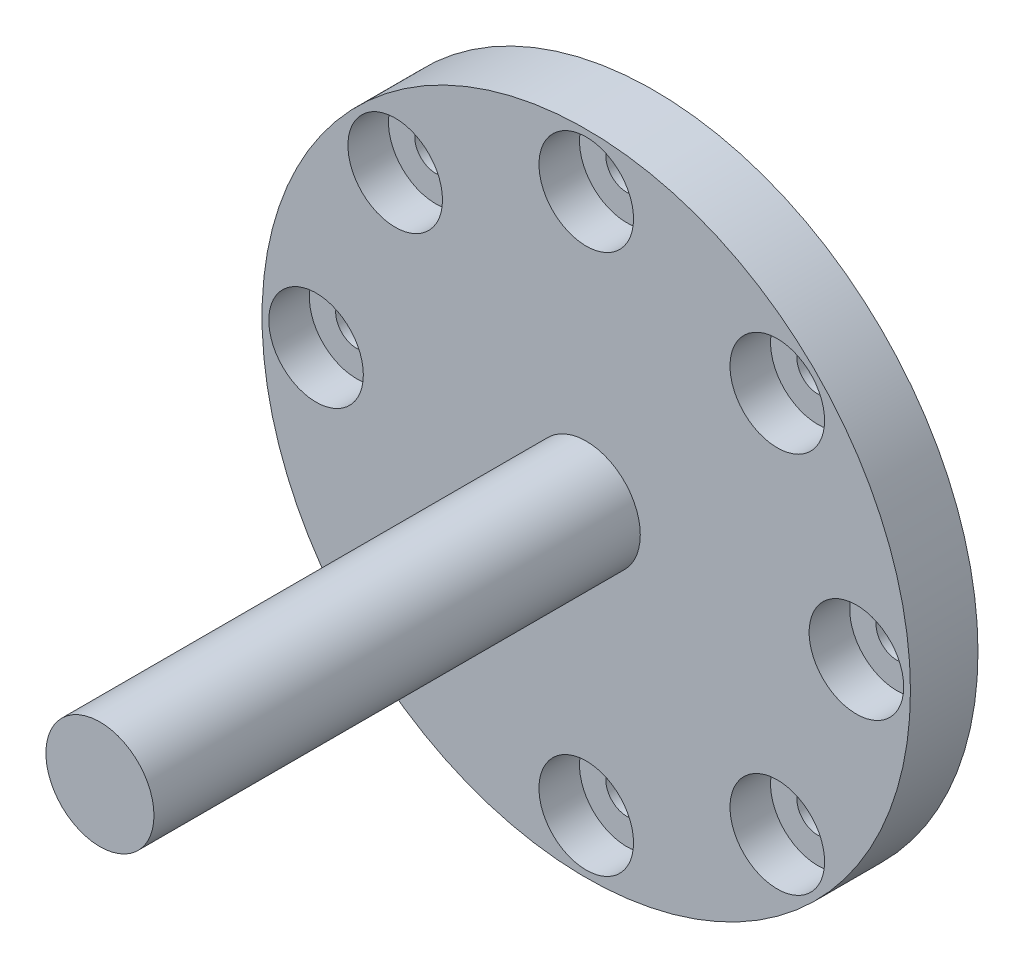
ISO-10303-21;
HEADER;
FILE_DESCRIPTION(('STEP AP214'),'2;1');
FILE_NAME('part.step','',(''),(''),'','','');
FILE_SCHEMA(('AUTOMOTIVE_DESIGN { 1 0 10303 214 1 1 1 1 }'));
ENDSEC;
DATA;
#1=APPLICATION_CONTEXT('core data for automotive mechanical design processes');
#2=APPLICATION_PROTOCOL_DEFINITION('international standard','automotive_design',2000,#1);
#3=PRODUCT_CONTEXT('',#1,'mechanical');
#4=PRODUCT('Part','Part','',(#3));
#5=PRODUCT_RELATED_PRODUCT_CATEGORY('part','',(#4));
#6=PRODUCT_DEFINITION_FORMATION('','',#4);
#7=PRODUCT_DEFINITION_CONTEXT('part definition',#1,'design');
#8=PRODUCT_DEFINITION('design','',#6,#7);
#9=PRODUCT_DEFINITION_SHAPE('','',#8);
#10=(LENGTH_UNIT() NAMED_UNIT(*) SI_UNIT(.MILLI.,.METRE.));
#11=(NAMED_UNIT(*) PLANE_ANGLE_UNIT() SI_UNIT($,.RADIAN.));
#12=(NAMED_UNIT(*) SI_UNIT($,.STERADIAN.) SOLID_ANGLE_UNIT());
#13=UNCERTAINTY_MEASURE_WITH_UNIT(LENGTH_MEASURE(1.E-05),#10,'distance_accuracy_value','');
#14=(GEOMETRIC_REPRESENTATION_CONTEXT(3) GLOBAL_UNCERTAINTY_ASSIGNED_CONTEXT((#13)) GLOBAL_UNIT_ASSIGNED_CONTEXT((#10,
#11,#12)) REPRESENTATION_CONTEXT('',''));
#15=CARTESIAN_POINT('',(0.,0.,0.));
#16=DIRECTION('',(0.,0.,1.));
#17=DIRECTION('',(1.,0.,0.));
#18=AXIS2_PLACEMENT_3D('',#15,#16,#17);
#19=CARTESIAN_POINT('',(14.1421356237307,14.1421356237303,9.38406204336157));
#20=DIRECTION('',(0.,0.,-1.));
#21=DIRECTION('',(-1.,0.,0.));
#22=AXIS2_PLACEMENT_3D('',#19,#20,#21);
#23=CYLINDRICAL_SURFACE('',#22,1.55000000000065);
#24=CARTESIAN_POINT('',(14.1421356237307,14.1421356237303,0.));
#25=DIRECTION('',(0.,0.,-1.));
#26=DIRECTION('',(-1.,0.,0.));
#27=AXIS2_PLACEMENT_3D('',#24,#25,#26);
#28=CIRCLE('',#27,1.55000000000065);
#29=CARTESIAN_POINT('',(12.5921356237301,14.1421356237303,0.));
#30=VERTEX_POINT('',#29);
#31=EDGE_CURVE('E50',#30,#30,#28,.T.);
#32=ORIENTED_EDGE('',*,*,#31,.T.);
#33=EDGE_LOOP('',(#32));
#34=FACE_BOUND('',#33,.T.);
#35=CARTESIAN_POINT('',(14.1421356237307,14.1421356237303,2.));
#36=DIRECTION('',(0.,0.,1.));
#37=DIRECTION('',(1.,0.,0.));
#38=AXIS2_PLACEMENT_3D('',#35,#36,#37);
#39=CIRCLE('',#38,1.55000000000065);
#40=CARTESIAN_POINT('',(15.6921356237314,14.1421356237303,2.));
#41=VERTEX_POINT('',#40);
#42=EDGE_CURVE('E38',#41,#41,#39,.F.);
#43=ORIENTED_EDGE('',*,*,#42,.F.);
#44=EDGE_LOOP('',(#43));
#45=FACE_BOUND('',#44,.T.);
#46=ADVANCED_FACE('F34',(#34,#45),#23,.F.);
#47=CARTESIAN_POINT('',(19.9999999999992,-8.5265128291212E-13,9.38406204336157));
#48=DIRECTION('',(0.,0.,-1.));
#49=DIRECTION('',(-1.,0.,0.));
#50=AXIS2_PLACEMENT_3D('',#47,#48,#49);
#51=CYLINDRICAL_SURFACE('',#50,1.55000000000126);
#52=CARTESIAN_POINT('',(19.9999999999992,-8.5265128291212E-13,0.));
#53=DIRECTION('',(0.,0.,-1.));
#54=DIRECTION('',(-1.,0.,0.));
#55=AXIS2_PLACEMENT_3D('',#52,#53,#54);
#56=CIRCLE('',#55,1.55000000000126);
#57=CARTESIAN_POINT('',(18.4499999999979,-8.5265128291212E-13,0.));
#58=VERTEX_POINT('',#57);
#59=EDGE_CURVE('E104',#58,#58,#56,.T.);
#60=ORIENTED_EDGE('',*,*,#59,.T.);
#61=EDGE_LOOP('',(#60));
#62=FACE_BOUND('',#61,.T.);
#63=CARTESIAN_POINT('',(19.9999999999992,-8.5265128291212E-13,2.));
#64=DIRECTION('',(0.,0.,1.));
#65=DIRECTION('',(1.,0.,0.));
#66=AXIS2_PLACEMENT_3D('',#63,#64,#65);
#67=CIRCLE('',#66,1.55000000000126);
#68=CARTESIAN_POINT('',(21.5500000000004,-8.5265128291212E-13,2.));
#69=VERTEX_POINT('',#68);
#70=EDGE_CURVE('E71',#69,#69,#67,.F.);
#71=ORIENTED_EDGE('',*,*,#70,.F.);
#72=EDGE_LOOP('',(#71));
#73=FACE_BOUND('',#72,.T.);
#74=ADVANCED_FACE('F134',(#62,#73),#51,.F.);
#75=CARTESIAN_POINT('',(14.1421356237295,-14.1421356237316,9.38406204336157));
#76=DIRECTION('',(0.,0.,-1.));
#77=DIRECTION('',(-1.,0.,0.));
#78=AXIS2_PLACEMENT_3D('',#75,#76,#77);
#79=CYLINDRICAL_SURFACE('',#78,1.55000000000173);
#80=CARTESIAN_POINT('',(14.1421356237295,-14.1421356237316,0.));
#81=DIRECTION('',(0.,0.,-1.));
#82=DIRECTION('',(-1.,0.,0.));
#83=AXIS2_PLACEMENT_3D('',#80,#81,#82);
#84=CIRCLE('',#83,1.55000000000173);
#85=CARTESIAN_POINT('',(12.5921356237278,-14.1421356237316,0.));
#86=VERTEX_POINT('',#85);
#87=EDGE_CURVE('E102',#86,#86,#84,.T.);
#88=ORIENTED_EDGE('',*,*,#87,.T.);
#89=EDGE_LOOP('',(#88));
#90=FACE_BOUND('',#89,.T.);
#91=CARTESIAN_POINT('',(14.1421356237295,-14.1421356237316,2.));
#92=DIRECTION('',(0.,0.,1.));
#93=DIRECTION('',(1.,0.,0.));
#94=AXIS2_PLACEMENT_3D('',#91,#92,#93);
#95=CIRCLE('',#94,1.55000000000173);
#96=CARTESIAN_POINT('',(15.6921356237312,-14.1421356237316,2.));
#97=VERTEX_POINT('',#96);
#98=EDGE_CURVE('E69',#97,#97,#95,.F.);
#99=ORIENTED_EDGE('',*,*,#98,.F.);
#100=EDGE_LOOP('',(#99));
#101=FACE_BOUND('',#100,.T.);
#102=ADVANCED_FACE('F139',(#90,#101),#79,.F.);
#103=CARTESIAN_POINT('',(-1.70040397862765E-12,-20.,9.38406204336157));
#104=DIRECTION('',(0.,0.,-1.));
#105=DIRECTION('',(-1.,0.,0.));
#106=AXIS2_PLACEMENT_3D('',#103,#104,#105);
#107=CYLINDRICAL_SURFACE('',#106,1.55000000000176);
#108=CARTESIAN_POINT('',(-1.70040397862765E-12,-20.,0.));
#109=DIRECTION('',(0.,0.,-1.));
#110=DIRECTION('',(-1.,0.,0.));
#111=AXIS2_PLACEMENT_3D('',#108,#109,#110);
#112=CIRCLE('',#111,1.55000000000176);
#113=CARTESIAN_POINT('',(-1.55000000000346,-20.,0.));
#114=VERTEX_POINT('',#113);
#115=EDGE_CURVE('E99',#114,#114,#112,.T.);
#116=ORIENTED_EDGE('',*,*,#115,.T.);
#117=EDGE_LOOP('',(#116));
#118=FACE_BOUND('',#117,.T.);
#119=CARTESIAN_POINT('',(-1.70040397862765E-12,-20.,2.));
#120=DIRECTION('',(0.,0.,1.));
#121=DIRECTION('',(1.,0.,0.));
#122=AXIS2_PLACEMENT_3D('',#119,#120,#121);
#123=CIRCLE('',#122,1.55000000000176);
#124=CARTESIAN_POINT('',(1.55000000000006,-20.,2.));
#125=VERTEX_POINT('',#124);
#126=EDGE_CURVE('E66',#125,#125,#123,.F.);
#127=ORIENTED_EDGE('',*,*,#126,.F.);
#128=EDGE_LOOP('',(#127));
#129=FACE_BOUND('',#128,.T.);
#130=ADVANCED_FACE('F144',(#118,#129),#107,.F.);
#131=CARTESIAN_POINT('',(-14.1421356237324,-14.1421356237303,9.38406204336157));
#132=DIRECTION('',(0.,0.,-1.));
#133=DIRECTION('',(-1.,0.,0.));
#134=AXIS2_PLACEMENT_3D('',#131,#132,#133);
#135=CYLINDRICAL_SURFACE('',#134,1.55000000000131);
#136=CARTESIAN_POINT('',(-14.1421356237324,-14.1421356237303,0.));
#137=DIRECTION('',(0.,0.,-1.));
#138=DIRECTION('',(-1.,0.,0.));
#139=AXIS2_PLACEMENT_3D('',#136,#137,#138);
#140=CIRCLE('',#139,1.55000000000131);
#141=CARTESIAN_POINT('',(-15.6921356237337,-14.1421356237303,0.));
#142=VERTEX_POINT('',#141);
#143=EDGE_CURVE('E96',#142,#142,#140,.T.);
#144=ORIENTED_EDGE('',*,*,#143,.T.);
#145=EDGE_LOOP('',(#144));
#146=FACE_BOUND('',#145,.T.);
#147=CARTESIAN_POINT('',(-14.1421356237324,-14.1421356237303,2.));
#148=DIRECTION('',(0.,0.,1.));
#149=DIRECTION('',(1.,0.,0.));
#150=AXIS2_PLACEMENT_3D('',#147,#148,#149);
#151=CIRCLE('',#150,1.55000000000131);
#152=CARTESIAN_POINT('',(-12.5921356237311,-14.1421356237303,2.));
#153=VERTEX_POINT('',#152);
#154=EDGE_CURVE('E63',#153,#153,#151,.F.);
#155=ORIENTED_EDGE('',*,*,#154,.F.);
#156=EDGE_LOOP('',(#155));
#157=FACE_BOUND('',#156,.T.);
#158=ADVANCED_FACE('F148',(#146,#157),#135,.F.);
#159=CARTESIAN_POINT('',(-20.0000000000008,8.50201989313825E-13,9.38406204336157));
#160=DIRECTION('',(0.,0.,-1.));
#161=DIRECTION('',(-1.,0.,0.));
#162=AXIS2_PLACEMENT_3D('',#159,#160,#161);
#163=CYLINDRICAL_SURFACE('',#162,1.55000000000063);
#164=CARTESIAN_POINT('',(-20.0000000000008,8.50201989313825E-13,0.));
#165=DIRECTION('',(0.,0.,-1.));
#166=DIRECTION('',(-1.,0.,0.));
#167=AXIS2_PLACEMENT_3D('',#164,#165,#166);
#168=CIRCLE('',#167,1.55000000000063);
#169=CARTESIAN_POINT('',(-21.5500000000015,8.50201989313825E-13,0.));
#170=VERTEX_POINT('',#169);
#171=EDGE_CURVE('E93',#170,#170,#168,.T.);
#172=ORIENTED_EDGE('',*,*,#171,.T.);
#173=EDGE_LOOP('',(#172));
#174=FACE_BOUND('',#173,.T.);
#175=CARTESIAN_POINT('',(-20.0000000000008,8.50201989313825E-13,2.));
#176=DIRECTION('',(0.,0.,1.));
#177=DIRECTION('',(1.,0.,0.));
#178=AXIS2_PLACEMENT_3D('',#175,#176,#177);
#179=CIRCLE('',#178,1.55000000000063);
#180=CARTESIAN_POINT('',(-18.4500000000002,8.50201989313825E-13,2.));
#181=VERTEX_POINT('',#180);
#182=EDGE_CURVE('E60',#181,#181,#179,.F.);
#183=ORIENTED_EDGE('',*,*,#182,.F.);
#184=EDGE_LOOP('',(#183));
#185=FACE_BOUND('',#184,.T.);
#186=ADVANCED_FACE('F152',(#174,#185),#163,.F.);
#187=CARTESIAN_POINT('',(-14.1421356237312,14.1421356237316,9.38406204336157));
#188=DIRECTION('',(0.,0.,-1.));
#189=DIRECTION('',(-1.,0.,0.));
#190=AXIS2_PLACEMENT_3D('',#187,#188,#189);
#191=CYLINDRICAL_SURFACE('',#190,1.5500000000001);
#192=CARTESIAN_POINT('',(-14.1421356237312,14.1421356237316,0.));
#193=DIRECTION('',(0.,0.,-1.));
#194=DIRECTION('',(-1.,0.,0.));
#195=AXIS2_PLACEMENT_3D('',#192,#193,#194);
#196=CIRCLE('',#195,1.5500000000001);
#197=CARTESIAN_POINT('',(-15.6921356237313,14.1421356237316,0.));
#198=VERTEX_POINT('',#197);
#199=EDGE_CURVE('E90',#198,#198,#196,.T.);
#200=ORIENTED_EDGE('',*,*,#199,.T.);
#201=EDGE_LOOP('',(#200));
#202=FACE_BOUND('',#201,.T.);
#203=CARTESIAN_POINT('',(-14.1421356237312,14.1421356237316,2.));
#204=DIRECTION('',(0.,0.,1.));
#205=DIRECTION('',(1.,0.,0.));
#206=AXIS2_PLACEMENT_3D('',#203,#204,#205);
#207=CIRCLE('',#206,1.5500000000001);
#208=CARTESIAN_POINT('',(-12.5921356237311,14.1421356237316,2.));
#209=VERTEX_POINT('',#208);
#210=EDGE_CURVE('E56',#209,#209,#207,.F.);
#211=ORIENTED_EDGE('',*,*,#210,.F.);
#212=EDGE_LOOP('',(#211));
#213=FACE_BOUND('',#212,.T.);
#214=ADVANCED_FACE('F130',(#202,#213),#191,.F.);
#215=CARTESIAN_POINT('',(0.,20.,9.38406204336157));
#216=DIRECTION('',(0.,0.,-1.));
#217=DIRECTION('',(-1.,0.,0.));
#218=AXIS2_PLACEMENT_3D('',#215,#216,#217);
#219=CYLINDRICAL_SURFACE('',#218,1.55);
#220=CARTESIAN_POINT('',(0.,20.,0.));
#221=DIRECTION('',(0.,0.,-1.));
#222=DIRECTION('',(-1.,0.,0.));
#223=AXIS2_PLACEMENT_3D('',#220,#221,#222);
#224=CIRCLE('',#223,1.55);
#225=CARTESIAN_POINT('',(-1.55,20.,0.));
#226=VERTEX_POINT('',#225);
#227=EDGE_CURVE('E47',#226,#226,#224,.T.);
#228=ORIENTED_EDGE('',*,*,#227,.T.);
#229=EDGE_LOOP('',(#228));
#230=FACE_BOUND('',#229,.T.);
#231=CARTESIAN_POINT('',(0.,20.,2.));
#232=DIRECTION('',(0.,0.,1.));
#233=DIRECTION('',(1.,0.,0.));
#234=AXIS2_PLACEMENT_3D('',#231,#232,#233);
#235=CIRCLE('',#234,1.55);
#236=CARTESIAN_POINT('',(1.55,20.,2.));
#237=VERTEX_POINT('',#236);
#238=EDGE_CURVE('E53',#237,#237,#235,.F.);
#239=ORIENTED_EDGE('',*,*,#238,.F.);
#240=EDGE_LOOP('',(#239));
#241=FACE_BOUND('',#240,.T.);
#242=ADVANCED_FACE('F122',(#230,#241),#219,.F.);
#243=CARTESIAN_POINT('',(0.,0.,5.));
#244=DIRECTION('',(0.,0.,-1.));
#245=DIRECTION('',(-1.,0.,0.));
#246=AXIS2_PLACEMENT_3D('',#243,#244,#245);
#247=CYLINDRICAL_SURFACE('',#246,24.);
#248=CARTESIAN_POINT('',(0.,0.,5.));
#249=DIRECTION('',(0.,0.,1.));
#250=DIRECTION('',(1.,0.,0.));
#251=AXIS2_PLACEMENT_3D('',#248,#249,#250);
#252=CIRCLE('',#251,24.);
#253=CARTESIAN_POINT('',(24.,0.,5.));
#254=VERTEX_POINT('',#253);
#255=EDGE_CURVE('E10',#254,#254,#252,.T.);
#256=ORIENTED_EDGE('',*,*,#255,.F.);
#257=EDGE_LOOP('',(#256));
#258=FACE_BOUND('',#257,.T.);
#259=CARTESIAN_POINT('',(0.,0.,0.));
#260=DIRECTION('',(0.,0.,1.));
#261=DIRECTION('',(1.,0.,0.));
#262=AXIS2_PLACEMENT_3D('',#259,#260,#261);
#263=CIRCLE('',#262,24.);
#264=CARTESIAN_POINT('',(24.,0.,0.));
#265=VERTEX_POINT('',#264);
#266=EDGE_CURVE('E42',#265,#265,#263,.T.);
#267=ORIENTED_EDGE('',*,*,#266,.T.);
#268=EDGE_LOOP('',(#267));
#269=FACE_BOUND('',#268,.T.);
#270=ADVANCED_FACE('F36',(#258,#269),#247,.T.);
#271=CARTESIAN_POINT('',(0.,0.,5.));
#272=DIRECTION('',(0.,0.,1.));
#273=DIRECTION('',(1.,0.,0.));
#274=AXIS2_PLACEMENT_3D('',#271,#272,#273);
#275=PLANE('',#274);
#276=CARTESIAN_POINT('',(-14.1421356237307,14.1421356237303,5.));
#277=DIRECTION('',(0.,0.,1.));
#278=DIRECTION('',(1.,0.,0.));
#279=AXIS2_PLACEMENT_3D('',#276,#277,#278);
#280=CIRCLE('',#279,3.50000000000065);
#281=CARTESIAN_POINT('',(-10.6421356237301,14.1421356237303,5.));
#282=VERTEX_POINT('',#281);
#283=EDGE_CURVE('E275',#282,#282,#280,.T.);
#284=ORIENTED_EDGE('',*,*,#283,.F.);
#285=EDGE_LOOP('',(#284));
#286=FACE_BOUND('',#285,.T.);
#287=CARTESIAN_POINT('',(-19.9999999999992,-8.5265128291212E-13,5.));
#288=DIRECTION('',(0.,0.,1.));
#289=DIRECTION('',(1.,0.,0.));
#290=AXIS2_PLACEMENT_3D('',#287,#288,#289);
#291=CIRCLE('',#290,3.50000000000126);
#292=CARTESIAN_POINT('',(-16.4999999999979,-8.5265128291212E-13,5.));
#293=VERTEX_POINT('',#292);
#294=EDGE_CURVE('E269',#293,#293,#291,.T.);
#295=ORIENTED_EDGE('',*,*,#294,.F.);
#296=EDGE_LOOP('',(#295));
#297=FACE_BOUND('',#296,.T.);
#298=CARTESIAN_POINT('',(-14.1421356237295,-14.1421356237316,5.));
#299=DIRECTION('',(0.,0.,1.));
#300=DIRECTION('',(1.,0.,0.));
#301=AXIS2_PLACEMENT_3D('',#298,#299,#300);
#302=CIRCLE('',#301,3.50000000000173);
#303=CARTESIAN_POINT('',(-10.6421356237278,-14.1421356237316,5.));
#304=VERTEX_POINT('',#303);
#305=EDGE_CURVE('E263',#304,#304,#302,.T.);
#306=ORIENTED_EDGE('',*,*,#305,.F.);
#307=EDGE_LOOP('',(#306));
#308=FACE_BOUND('',#307,.T.);
#309=CARTESIAN_POINT('',(1.70040397862765E-12,-20.,5.));
#310=DIRECTION('',(0.,0.,1.));
#311=DIRECTION('',(1.,0.,0.));
#312=AXIS2_PLACEMENT_3D('',#309,#310,#311);
#313=CIRCLE('',#312,3.50000000000176);
#314=CARTESIAN_POINT('',(3.50000000000346,-20.,5.));
#315=VERTEX_POINT('',#314);
#316=EDGE_CURVE('E257',#315,#315,#313,.T.);
#317=ORIENTED_EDGE('',*,*,#316,.F.);
#318=EDGE_LOOP('',(#317));
#319=FACE_BOUND('',#318,.T.);
#320=CARTESIAN_POINT('',(14.1421356237324,-14.1421356237303,5.));
#321=DIRECTION('',(0.,0.,1.));
#322=DIRECTION('',(1.,0.,0.));
#323=AXIS2_PLACEMENT_3D('',#320,#321,#322);
#324=CIRCLE('',#323,3.50000000000131);
#325=CARTESIAN_POINT('',(17.6421356237337,-14.1421356237303,5.));
#326=VERTEX_POINT('',#325);
#327=EDGE_CURVE('E251',#326,#326,#324,.T.);
#328=ORIENTED_EDGE('',*,*,#327,.F.);
#329=EDGE_LOOP('',(#328));
#330=FACE_BOUND('',#329,.T.);
#331=CARTESIAN_POINT('',(20.0000000000008,8.50201989313825E-13,5.));
#332=DIRECTION('',(0.,0.,1.));
#333=DIRECTION('',(1.,0.,0.));
#334=AXIS2_PLACEMENT_3D('',#331,#332,#333);
#335=CIRCLE('',#334,3.50000000000063);
#336=CARTESIAN_POINT('',(23.5000000000015,8.50201989313825E-13,5.));
#337=VERTEX_POINT('',#336);
#338=EDGE_CURVE('E245',#337,#337,#335,.T.);
#339=ORIENTED_EDGE('',*,*,#338,.F.);
#340=EDGE_LOOP('',(#339));
#341=FACE_BOUND('',#340,.T.);
#342=CARTESIAN_POINT('',(14.1421356237312,14.1421356237316,5.));
#343=DIRECTION('',(0.,0.,1.));
#344=DIRECTION('',(1.,0.,0.));
#345=AXIS2_PLACEMENT_3D('',#342,#343,#344);
#346=CIRCLE('',#345,3.5000000000001);
#347=CARTESIAN_POINT('',(17.6421356237313,14.1421356237316,5.));
#348=VERTEX_POINT('',#347);
#349=EDGE_CURVE('E236',#348,#348,#346,.T.);
#350=ORIENTED_EDGE('',*,*,#349,.F.);
#351=EDGE_LOOP('',(#350));
#352=FACE_BOUND('',#351,.T.);
#353=CARTESIAN_POINT('',(0.,20.,5.));
#354=DIRECTION('',(0.,0.,1.));
#355=DIRECTION('',(1.,0.,0.));
#356=AXIS2_PLACEMENT_3D('',#353,#354,#355);
#357=CIRCLE('',#356,3.5);
#358=CARTESIAN_POINT('',(3.5,20.,5.));
#359=VERTEX_POINT('',#358);
#360=EDGE_CURVE('E235',#359,#359,#357,.T.);
#361=ORIENTED_EDGE('',*,*,#360,.F.);
#362=EDGE_LOOP('',(#361));
#363=FACE_BOUND('',#362,.T.);
#364=CARTESIAN_POINT('',(0.,0.,5.));
#365=DIRECTION('',(0.,0.,1.));
#366=DIRECTION('',(1.,0.,0.));
#367=AXIS2_PLACEMENT_3D('',#364,#365,#366);
#368=CIRCLE('',#367,4.);
#369=CARTESIAN_POINT('',(4.,0.,5.));
#370=VERTEX_POINT('',#369);
#371=EDGE_CURVE('E76',#370,#370,#368,.T.);
#372=ORIENTED_EDGE('',*,*,#371,.F.);
#373=EDGE_LOOP('',(#372));
#374=FACE_BOUND('',#373,.T.);
#375=ORIENTED_EDGE('',*,*,#255,.T.);
#376=EDGE_LOOP('',(#375));
#377=FACE_BOUND('',#376,.T.);
#378=ADVANCED_FACE('F117',(#286,#297,#308,#319,#330,#341,#352,#363,#374,#377),#275,.T.);
#379=CARTESIAN_POINT('',(0.,0.,0.));
#380=DIRECTION('',(0.,0.,1.));
#381=DIRECTION('',(1.,0.,0.));
#382=AXIS2_PLACEMENT_3D('',#379,#380,#381);
#383=PLANE('',#382);
#384=ORIENTED_EDGE('',*,*,#227,.F.);
#385=EDGE_LOOP('',(#384));
#386=FACE_BOUND('',#385,.T.);
#387=ORIENTED_EDGE('',*,*,#199,.F.);
#388=EDGE_LOOP('',(#387));
#389=FACE_BOUND('',#388,.T.);
#390=ORIENTED_EDGE('',*,*,#171,.F.);
#391=EDGE_LOOP('',(#390));
#392=FACE_BOUND('',#391,.T.);
#393=ORIENTED_EDGE('',*,*,#143,.F.);
#394=EDGE_LOOP('',(#393));
#395=FACE_BOUND('',#394,.T.);
#396=ORIENTED_EDGE('',*,*,#115,.F.);
#397=EDGE_LOOP('',(#396));
#398=FACE_BOUND('',#397,.T.);
#399=ORIENTED_EDGE('',*,*,#87,.F.);
#400=EDGE_LOOP('',(#399));
#401=FACE_BOUND('',#400,.T.);
#402=ORIENTED_EDGE('',*,*,#59,.F.);
#403=EDGE_LOOP('',(#402));
#404=FACE_BOUND('',#403,.T.);
#405=ORIENTED_EDGE('',*,*,#31,.F.);
#406=EDGE_LOOP('',(#405));
#407=FACE_BOUND('',#406,.T.);
#408=ORIENTED_EDGE('',*,*,#266,.F.);
#409=EDGE_LOOP('',(#408));
#410=FACE_BOUND('',#409,.T.);
#411=ADVANCED_FACE('F113',(#386,#389,#392,#395,#398,#401,#404,#407,#410),#383,.F.);
#412=CARTESIAN_POINT('',(0.,0.,41.));
#413=DIRECTION('',(0.,0.,-1.));
#414=DIRECTION('',(-1.,0.,0.));
#415=AXIS2_PLACEMENT_3D('',#412,#413,#414);
#416=CYLINDRICAL_SURFACE('',#415,4.);
#417=CARTESIAN_POINT('',(0.,0.,41.));
#418=DIRECTION('',(0.,0.,1.));
#419=DIRECTION('',(1.,0.,0.));
#420=AXIS2_PLACEMENT_3D('',#417,#418,#419);
#421=CIRCLE('',#420,4.);
#422=CARTESIAN_POINT('',(4.,0.,41.));
#423=VERTEX_POINT('',#422);
#424=EDGE_CURVE('E80',#423,#423,#421,.T.);
#425=ORIENTED_EDGE('',*,*,#424,.F.);
#426=EDGE_LOOP('',(#425));
#427=FACE_BOUND('',#426,.T.);
#428=ORIENTED_EDGE('',*,*,#371,.T.);
#429=EDGE_LOOP('',(#428));
#430=FACE_BOUND('',#429,.T.);
#431=ADVANCED_FACE('F116',(#427,#430),#416,.T.);
#432=CARTESIAN_POINT('',(0.,0.,41.));
#433=DIRECTION('',(0.,0.,1.));
#434=DIRECTION('',(1.,0.,0.));
#435=AXIS2_PLACEMENT_3D('',#432,#433,#434);
#436=PLANE('',#435);
#437=ORIENTED_EDGE('',*,*,#424,.T.);
#438=EDGE_LOOP('',(#437));
#439=FACE_BOUND('',#438,.T.);
#440=ADVANCED_FACE('F162',(#439),#436,.T.);
#441=CARTESIAN_POINT('',(0.,20.,2.));
#442=DIRECTION('',(0.,0.,1.));
#443=DIRECTION('',(1.,0.,0.));
#444=AXIS2_PLACEMENT_3D('',#441,#442,#443);
#445=PLANE('',#444);
#446=CARTESIAN_POINT('',(0.,20.,2.));
#447=DIRECTION('',(0.,0.,1.));
#448=DIRECTION('',(1.,0.,0.));
#449=AXIS2_PLACEMENT_3D('',#446,#447,#448);
#450=CIRCLE('',#449,3.5);
#451=CARTESIAN_POINT('',(3.5,20.,2.));
#452=VERTEX_POINT('',#451);
#453=EDGE_CURVE('E57',#452,#452,#450,.T.);
#454=ORIENTED_EDGE('',*,*,#453,.T.);
#455=EDGE_LOOP('',(#454));
#456=FACE_BOUND('',#455,.T.);
#457=ORIENTED_EDGE('',*,*,#238,.T.);
#458=EDGE_LOOP('',(#457));
#459=FACE_BOUND('',#458,.T.);
#460=ADVANCED_FACE('F166',(#456,#459),#445,.T.);
#461=CARTESIAN_POINT('',(0.,20.,2.));
#462=DIRECTION('',(0.,0.,1.));
#463=DIRECTION('',(1.,0.,0.));
#464=AXIS2_PLACEMENT_3D('',#461,#462,#463);
#465=CYLINDRICAL_SURFACE('',#464,3.5);
#466=ORIENTED_EDGE('',*,*,#453,.F.);
#467=EDGE_LOOP('',(#466));
#468=FACE_BOUND('',#467,.T.);
#469=ORIENTED_EDGE('',*,*,#360,.T.);
#470=EDGE_LOOP('',(#469));
#471=FACE_BOUND('',#470,.T.);
#472=ADVANCED_FACE('F168',(#468,#471),#465,.F.);
#473=CARTESIAN_POINT('',(-14.1421356237307,14.1421356237303,2.));
#474=DIRECTION('',(0.,0.,1.));
#475=DIRECTION('',(1.,0.,0.));
#476=AXIS2_PLACEMENT_3D('',#473,#474,#475);
#477=PLANE('',#476);
#478=CARTESIAN_POINT('',(-14.1421356237307,14.1421356237303,2.));
#479=DIRECTION('',(0.,0.,1.));
#480=DIRECTION('',(1.,0.,0.));
#481=AXIS2_PLACEMENT_3D('',#478,#479,#480);
#482=CIRCLE('',#481,3.50000000000065);
#483=CARTESIAN_POINT('',(-10.6421356237301,14.1421356237303,2.));
#484=VERTEX_POINT('',#483);
#485=EDGE_CURVE('E272',#484,#484,#482,.T.);
#486=ORIENTED_EDGE('',*,*,#485,.T.);
#487=EDGE_LOOP('',(#486));
#488=FACE_BOUND('',#487,.T.);
#489=ORIENTED_EDGE('',*,*,#210,.T.);
#490=EDGE_LOOP('',(#489));
#491=FACE_BOUND('',#490,.T.);
#492=ADVANCED_FACE('F171',(#488,#491),#477,.T.);
#493=CARTESIAN_POINT('',(-14.1421356237307,14.1421356237303,2.));
#494=DIRECTION('',(0.,0.,1.));
#495=DIRECTION('',(1.,0.,0.));
#496=AXIS2_PLACEMENT_3D('',#493,#494,#495);
#497=CYLINDRICAL_SURFACE('',#496,3.50000000000065);
#498=ORIENTED_EDGE('',*,*,#485,.F.);
#499=EDGE_LOOP('',(#498));
#500=FACE_BOUND('',#499,.T.);
#501=ORIENTED_EDGE('',*,*,#283,.T.);
#502=EDGE_LOOP('',(#501));
#503=FACE_BOUND('',#502,.T.);
#504=ADVANCED_FACE('F176',(#500,#503),#497,.F.);
#505=CARTESIAN_POINT('',(-19.9999999999992,-8.5265128291212E-13,2.));
#506=DIRECTION('',(0.,0.,1.));
#507=DIRECTION('',(1.,0.,0.));
#508=AXIS2_PLACEMENT_3D('',#505,#506,#507);
#509=PLANE('',#508);
#510=CARTESIAN_POINT('',(-19.9999999999992,-8.5265128291212E-13,2.));
#511=DIRECTION('',(0.,0.,1.));
#512=DIRECTION('',(1.,0.,0.));
#513=AXIS2_PLACEMENT_3D('',#510,#511,#512);
#514=CIRCLE('',#513,3.50000000000126);
#515=CARTESIAN_POINT('',(-16.4999999999979,-8.5265128291212E-13,2.));
#516=VERTEX_POINT('',#515);
#517=EDGE_CURVE('E266',#516,#516,#514,.T.);
#518=ORIENTED_EDGE('',*,*,#517,.T.);
#519=EDGE_LOOP('',(#518));
#520=FACE_BOUND('',#519,.T.);
#521=ORIENTED_EDGE('',*,*,#182,.T.);
#522=EDGE_LOOP('',(#521));
#523=FACE_BOUND('',#522,.T.);
#524=ADVANCED_FACE('F179',(#520,#523),#509,.T.);
#525=CARTESIAN_POINT('',(-19.9999999999992,-8.5265128291212E-13,2.));
#526=DIRECTION('',(0.,0.,1.));
#527=DIRECTION('',(1.,0.,0.));
#528=AXIS2_PLACEMENT_3D('',#525,#526,#527);
#529=CYLINDRICAL_SURFACE('',#528,3.50000000000126);
#530=ORIENTED_EDGE('',*,*,#517,.F.);
#531=EDGE_LOOP('',(#530));
#532=FACE_BOUND('',#531,.T.);
#533=ORIENTED_EDGE('',*,*,#294,.T.);
#534=EDGE_LOOP('',(#533));
#535=FACE_BOUND('',#534,.T.);
#536=ADVANCED_FACE('F184',(#532,#535),#529,.F.);
#537=CARTESIAN_POINT('',(-14.1421356237295,-14.1421356237316,2.));
#538=DIRECTION('',(0.,0.,1.));
#539=DIRECTION('',(1.,0.,0.));
#540=AXIS2_PLACEMENT_3D('',#537,#538,#539);
#541=PLANE('',#540);
#542=CARTESIAN_POINT('',(-14.1421356237295,-14.1421356237316,2.));
#543=DIRECTION('',(0.,0.,1.));
#544=DIRECTION('',(1.,0.,0.));
#545=AXIS2_PLACEMENT_3D('',#542,#543,#544);
#546=CIRCLE('',#545,3.50000000000173);
#547=CARTESIAN_POINT('',(-10.6421356237278,-14.1421356237316,2.));
#548=VERTEX_POINT('',#547);
#549=EDGE_CURVE('E260',#548,#548,#546,.T.);
#550=ORIENTED_EDGE('',*,*,#549,.T.);
#551=EDGE_LOOP('',(#550));
#552=FACE_BOUND('',#551,.T.);
#553=ORIENTED_EDGE('',*,*,#154,.T.);
#554=EDGE_LOOP('',(#553));
#555=FACE_BOUND('',#554,.T.);
#556=ADVANCED_FACE('F187',(#552,#555),#541,.T.);
#557=CARTESIAN_POINT('',(-14.1421356237295,-14.1421356237316,2.));
#558=DIRECTION('',(0.,0.,1.));
#559=DIRECTION('',(1.,0.,0.));
#560=AXIS2_PLACEMENT_3D('',#557,#558,#559);
#561=CYLINDRICAL_SURFACE('',#560,3.50000000000173);
#562=ORIENTED_EDGE('',*,*,#549,.F.);
#563=EDGE_LOOP('',(#562));
#564=FACE_BOUND('',#563,.T.);
#565=ORIENTED_EDGE('',*,*,#305,.T.);
#566=EDGE_LOOP('',(#565));
#567=FACE_BOUND('',#566,.T.);
#568=ADVANCED_FACE('F192',(#564,#567),#561,.F.);
#569=CARTESIAN_POINT('',(1.70040397862765E-12,-20.,2.));
#570=DIRECTION('',(0.,0.,1.));
#571=DIRECTION('',(1.,0.,0.));
#572=AXIS2_PLACEMENT_3D('',#569,#570,#571);
#573=PLANE('',#572);
#574=CARTESIAN_POINT('',(1.70040397862765E-12,-20.,2.));
#575=DIRECTION('',(0.,0.,1.));
#576=DIRECTION('',(1.,0.,0.));
#577=AXIS2_PLACEMENT_3D('',#574,#575,#576);
#578=CIRCLE('',#577,3.50000000000176);
#579=CARTESIAN_POINT('',(3.50000000000346,-20.,2.));
#580=VERTEX_POINT('',#579);
#581=EDGE_CURVE('E254',#580,#580,#578,.T.);
#582=ORIENTED_EDGE('',*,*,#581,.T.);
#583=EDGE_LOOP('',(#582));
#584=FACE_BOUND('',#583,.T.);
#585=ORIENTED_EDGE('',*,*,#126,.T.);
#586=EDGE_LOOP('',(#585));
#587=FACE_BOUND('',#586,.T.);
#588=ADVANCED_FACE('F195',(#584,#587),#573,.T.);
#589=CARTESIAN_POINT('',(1.70040397862765E-12,-20.,2.));
#590=DIRECTION('',(0.,0.,1.));
#591=DIRECTION('',(1.,0.,0.));
#592=AXIS2_PLACEMENT_3D('',#589,#590,#591);
#593=CYLINDRICAL_SURFACE('',#592,3.50000000000176);
#594=ORIENTED_EDGE('',*,*,#581,.F.);
#595=EDGE_LOOP('',(#594));
#596=FACE_BOUND('',#595,.T.);
#597=ORIENTED_EDGE('',*,*,#316,.T.);
#598=EDGE_LOOP('',(#597));
#599=FACE_BOUND('',#598,.T.);
#600=ADVANCED_FACE('F200',(#596,#599),#593,.F.);
#601=CARTESIAN_POINT('',(14.1421356237324,-14.1421356237303,2.));
#602=DIRECTION('',(0.,0.,1.));
#603=DIRECTION('',(1.,0.,0.));
#604=AXIS2_PLACEMENT_3D('',#601,#602,#603);
#605=PLANE('',#604);
#606=CARTESIAN_POINT('',(14.1421356237324,-14.1421356237303,2.));
#607=DIRECTION('',(0.,0.,1.));
#608=DIRECTION('',(1.,0.,0.));
#609=AXIS2_PLACEMENT_3D('',#606,#607,#608);
#610=CIRCLE('',#609,3.50000000000131);
#611=CARTESIAN_POINT('',(17.6421356237337,-14.1421356237303,2.));
#612=VERTEX_POINT('',#611);
#613=EDGE_CURVE('E248',#612,#612,#610,.T.);
#614=ORIENTED_EDGE('',*,*,#613,.T.);
#615=EDGE_LOOP('',(#614));
#616=FACE_BOUND('',#615,.T.);
#617=ORIENTED_EDGE('',*,*,#98,.T.);
#618=EDGE_LOOP('',(#617));
#619=FACE_BOUND('',#618,.T.);
#620=ADVANCED_FACE('F203',(#616,#619),#605,.T.);
#621=CARTESIAN_POINT('',(14.1421356237324,-14.1421356237303,2.));
#622=DIRECTION('',(0.,0.,1.));
#623=DIRECTION('',(1.,0.,0.));
#624=AXIS2_PLACEMENT_3D('',#621,#622,#623);
#625=CYLINDRICAL_SURFACE('',#624,3.50000000000131);
#626=ORIENTED_EDGE('',*,*,#613,.F.);
#627=EDGE_LOOP('',(#626));
#628=FACE_BOUND('',#627,.T.);
#629=ORIENTED_EDGE('',*,*,#327,.T.);
#630=EDGE_LOOP('',(#629));
#631=FACE_BOUND('',#630,.T.);
#632=ADVANCED_FACE('F208',(#628,#631),#625,.F.);
#633=CARTESIAN_POINT('',(20.0000000000008,8.50201989313825E-13,2.));
#634=DIRECTION('',(0.,0.,1.));
#635=DIRECTION('',(1.,0.,0.));
#636=AXIS2_PLACEMENT_3D('',#633,#634,#635);
#637=PLANE('',#636);
#638=CARTESIAN_POINT('',(20.0000000000008,8.50201989313825E-13,2.));
#639=DIRECTION('',(0.,0.,1.));
#640=DIRECTION('',(1.,0.,0.));
#641=AXIS2_PLACEMENT_3D('',#638,#639,#640);
#642=CIRCLE('',#641,3.50000000000063);
#643=CARTESIAN_POINT('',(23.5000000000015,8.50201989313825E-13,2.));
#644=VERTEX_POINT('',#643);
#645=EDGE_CURVE('E240',#644,#644,#642,.T.);
#646=ORIENTED_EDGE('',*,*,#645,.T.);
#647=EDGE_LOOP('',(#646));
#648=FACE_BOUND('',#647,.T.);
#649=ORIENTED_EDGE('',*,*,#70,.T.);
#650=EDGE_LOOP('',(#649));
#651=FACE_BOUND('',#650,.T.);
#652=ADVANCED_FACE('F211',(#648,#651),#637,.T.);
#653=CARTESIAN_POINT('',(20.0000000000008,8.50201989313825E-13,2.));
#654=DIRECTION('',(0.,0.,1.));
#655=DIRECTION('',(1.,0.,0.));
#656=AXIS2_PLACEMENT_3D('',#653,#654,#655);
#657=CYLINDRICAL_SURFACE('',#656,3.50000000000063);
#658=ORIENTED_EDGE('',*,*,#645,.F.);
#659=EDGE_LOOP('',(#658));
#660=FACE_BOUND('',#659,.T.);
#661=ORIENTED_EDGE('',*,*,#338,.T.);
#662=EDGE_LOOP('',(#661));
#663=FACE_BOUND('',#662,.T.);
#664=ADVANCED_FACE('F216',(#660,#663),#657,.F.);
#665=CARTESIAN_POINT('',(14.1421356237312,14.1421356237316,2.));
#666=DIRECTION('',(0.,0.,1.));
#667=DIRECTION('',(1.,0.,0.));
#668=AXIS2_PLACEMENT_3D('',#665,#666,#667);
#669=PLANE('',#668);
#670=CARTESIAN_POINT('',(14.1421356237312,14.1421356237316,2.));
#671=DIRECTION('',(0.,0.,1.));
#672=DIRECTION('',(1.,0.,0.));
#673=AXIS2_PLACEMENT_3D('',#670,#671,#672);
#674=CIRCLE('',#673,3.5000000000001);
#675=CARTESIAN_POINT('',(17.6421356237313,14.1421356237316,2.));
#676=VERTEX_POINT('',#675);
#677=EDGE_CURVE('E234',#676,#676,#674,.T.);
#678=ORIENTED_EDGE('',*,*,#677,.T.);
#679=EDGE_LOOP('',(#678));
#680=FACE_BOUND('',#679,.T.);
#681=ORIENTED_EDGE('',*,*,#42,.T.);
#682=EDGE_LOOP('',(#681));
#683=FACE_BOUND('',#682,.T.);
#684=ADVANCED_FACE('F219',(#680,#683),#669,.T.);
#685=CARTESIAN_POINT('',(14.1421356237312,14.1421356237316,2.));
#686=DIRECTION('',(0.,0.,1.));
#687=DIRECTION('',(1.,0.,0.));
#688=AXIS2_PLACEMENT_3D('',#685,#686,#687);
#689=CYLINDRICAL_SURFACE('',#688,3.5000000000001);
#690=ORIENTED_EDGE('',*,*,#677,.F.);
#691=EDGE_LOOP('',(#690));
#692=FACE_BOUND('',#691,.T.);
#693=ORIENTED_EDGE('',*,*,#349,.T.);
#694=EDGE_LOOP('',(#693));
#695=FACE_BOUND('',#694,.T.);
#696=ADVANCED_FACE('F224',(#692,#695),#689,.F.);
#697=CLOSED_SHELL('',(#46,#74,#102,#130,#158,#186,#214,#242,#270,#378,#411,#431,#440,#460,#472,
#492,#504,#524,#536,#556,#568,#588,#600,#620,#632,#652,#664,#684,#696));
#698=MANIFOLD_SOLID_BREP('B2',#697);
#699=ADVANCED_BREP_SHAPE_REPRESENTATION('',(#18,#698),#14);
#700=SHAPE_DEFINITION_REPRESENTATION(#9,#699);
ENDSEC;
END-ISO-10303-21;
